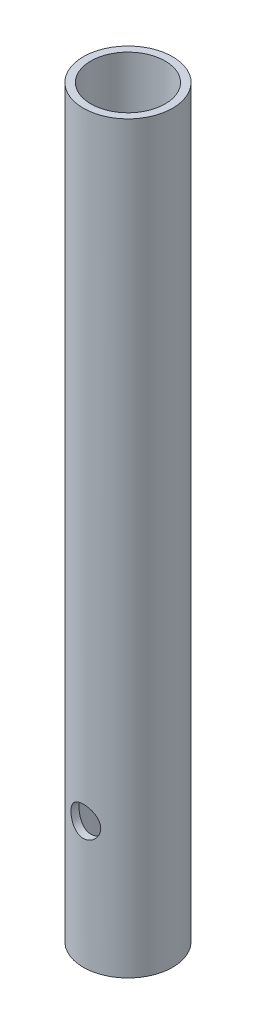
ISO-10303-21;
HEADER;
FILE_DESCRIPTION(('STEP AP214'),'2;1');
FILE_NAME('part.step','',(''),(''),'','','');
FILE_SCHEMA(('AUTOMOTIVE_DESIGN { 1 0 10303 214 1 1 1 1 }'));
ENDSEC;
DATA;
#1=APPLICATION_CONTEXT('core data for automotive mechanical design processes');
#2=APPLICATION_PROTOCOL_DEFINITION('international standard','automotive_design',2000,#1);
#3=PRODUCT_CONTEXT('',#1,'mechanical');
#4=PRODUCT('Part','Part','',(#3));
#5=PRODUCT_RELATED_PRODUCT_CATEGORY('part','',(#4));
#6=PRODUCT_DEFINITION_FORMATION('','',#4);
#7=PRODUCT_DEFINITION_CONTEXT('part definition',#1,'design');
#8=PRODUCT_DEFINITION('design','',#6,#7);
#9=PRODUCT_DEFINITION_SHAPE('','',#8);
#10=(LENGTH_UNIT() NAMED_UNIT(*) SI_UNIT(.MILLI.,.METRE.));
#11=(NAMED_UNIT(*) PLANE_ANGLE_UNIT() SI_UNIT($,.RADIAN.));
#12=(NAMED_UNIT(*) SI_UNIT($,.STERADIAN.) SOLID_ANGLE_UNIT());
#13=UNCERTAINTY_MEASURE_WITH_UNIT(LENGTH_MEASURE(1.E-05),#10,'distance_accuracy_value','');
#14=(GEOMETRIC_REPRESENTATION_CONTEXT(3) GLOBAL_UNCERTAINTY_ASSIGNED_CONTEXT((#13)) GLOBAL_UNIT_ASSIGNED_CONTEXT((#10,
#11,#12)) REPRESENTATION_CONTEXT('',''));
#15=CARTESIAN_POINT('',(0.,0.,0.));
#16=DIRECTION('',(0.,0.,1.));
#17=DIRECTION('',(1.,0.,0.));
#18=AXIS2_PLACEMENT_3D('',#15,#16,#17);
#19=CARTESIAN_POINT('',(0.,100.,0.));
#20=DIRECTION('',(0.,1.,0.));
#21=DIRECTION('',(0.,0.,1.));
#22=AXIS2_PLACEMENT_3D('',#19,#20,#21);
#23=PLANE('',#22);
#24=CARTESIAN_POINT('',(0.,100.,0.));
#25=DIRECTION('',(0.,1.,0.));
#26=DIRECTION('',(0.,0.,1.));
#27=AXIS2_PLACEMENT_3D('',#24,#25,#26);
#28=CIRCLE('',#27,6.);
#29=CARTESIAN_POINT('',(0.,100.,6.));
#30=VERTEX_POINT('',#29);
#31=EDGE_CURVE('E11',#30,#30,#28,.T.);
#32=ORIENTED_EDGE('',*,*,#31,.T.);
#33=EDGE_LOOP('',(#32));
#34=FACE_BOUND('',#33,.T.);
#35=CARTESIAN_POINT('',(0.,100.,0.));
#36=DIRECTION('',(0.,1.,0.));
#37=DIRECTION('',(1.,0.,0.));
#38=AXIS2_PLACEMENT_3D('',#35,#36,#37);
#39=CIRCLE('',#38,5.);
#40=CARTESIAN_POINT('',(5.,100.,0.));
#41=VERTEX_POINT('',#40);
#42=EDGE_CURVE('E58',#41,#41,#39,.T.);
#43=ORIENTED_EDGE('',*,*,#42,.F.);
#44=EDGE_LOOP('',(#43));
#45=FACE_BOUND('',#44,.T.);
#46=ADVANCED_FACE('F39',(#34,#45),#23,.T.);
#47=CARTESIAN_POINT('',(0.,0.,0.));
#48=DIRECTION('',(0.,1.,0.));
#49=DIRECTION('',(0.,0.,1.));
#50=AXIS2_PLACEMENT_3D('',#47,#48,#49);
#51=PLANE('',#50);
#52=CARTESIAN_POINT('',(0.,0.,0.));
#53=DIRECTION('',(0.,1.,0.));
#54=DIRECTION('',(0.,0.,1.));
#55=AXIS2_PLACEMENT_3D('',#52,#53,#54);
#56=CIRCLE('',#55,6.);
#57=CARTESIAN_POINT('',(0.,0.,6.));
#58=VERTEX_POINT('',#57);
#59=EDGE_CURVE('E53',#58,#58,#56,.T.);
#60=ORIENTED_EDGE('',*,*,#59,.F.);
#61=EDGE_LOOP('',(#60));
#62=FACE_BOUND('',#61,.T.);
#63=CARTESIAN_POINT('',(0.,0.,0.));
#64=DIRECTION('',(0.,1.,0.));
#65=DIRECTION('',(1.,0.,0.));
#66=AXIS2_PLACEMENT_3D('',#63,#64,#65);
#67=CIRCLE('',#66,5.);
#68=CARTESIAN_POINT('',(5.,0.,0.));
#69=VERTEX_POINT('',#68);
#70=EDGE_CURVE('E61',#69,#69,#67,.T.);
#71=ORIENTED_EDGE('',*,*,#70,.T.);
#72=EDGE_LOOP('',(#71));
#73=FACE_BOUND('',#72,.T.);
#74=ADVANCED_FACE('F97',(#62,#73),#51,.F.);
#75=CARTESIAN_POINT('',(0.,100.,0.));
#76=DIRECTION('',(0.,-1.,0.));
#77=DIRECTION('',(0.,0.,-1.));
#78=AXIS2_PLACEMENT_3D('',#75,#76,#77);
#79=CYLINDRICAL_SURFACE('',#78,6.);
#80=CARTESIAN_POINT('',(0.,19.,-6.));
#81=CARTESIAN_POINT('',(-0.109126725773447,19.0000005074633,-6.00000030601888));
#82=CARTESIAN_POINT('',(-0.218250389077101,18.9910394677456,-5.9969953901509));
#83=CARTESIAN_POINT('',(-0.433283521745947,18.9555417823656,-5.98530420406562));
#84=CARTESIAN_POINT('',(-0.539192656237637,18.9290033121022,-5.97661734404305));
#85=CARTESIAN_POINT('',(-0.744665579003553,18.8593615132319,-5.95450615812885));
#86=CARTESIAN_POINT('',(-0.84423965177207,18.8162858750815,-5.94108975461707));
#87=CARTESIAN_POINT('',(-1.03474987361065,18.7149176543233,-5.91088891434684));
#88=CARTESIAN_POINT('',(-1.12568431391741,18.6566220699948,-5.89410381335556));
#89=CARTESIAN_POINT('',(-1.29948335004454,18.5243483902825,-5.8582818888601));
#90=CARTESIAN_POINT('',(-1.38200740059662,18.449937531479,-5.8391911292757));
#91=CARTESIAN_POINT('',(-1.53366538540417,18.2884656905869,-5.80120629566243));
#92=CARTESIAN_POINT('',(-1.60279637097893,18.201401930143,-5.78231226581098));
#93=CARTESIAN_POINT('',(-1.72764988445572,18.0140297696071,-5.74626664954547));
#94=CARTESIAN_POINT('',(-1.78292971644207,17.9134125205358,-5.72918078551376));
#95=CARTESIAN_POINT('',(-1.87563774775545,17.7036478110829,-5.69950610837202));
#96=CARTESIAN_POINT('',(-1.91307139477353,17.5945029656745,-5.68691592321491));
#97=CARTESIAN_POINT('',(-1.96774692301833,17.3746535570066,-5.66822606538754));
#98=CARTESIAN_POINT('',(-1.98562689654354,17.2641255830219,-5.66192191539222));
#99=CARTESIAN_POINT('',(-2.00268224666896,17.0414724916882,-5.65591313259015));
#100=CARTESIAN_POINT('',(-2.00186340320944,16.9293478785816,-5.6562064604546));
#101=CARTESIAN_POINT('',(-1.98203980740684,16.712126739112,-5.6631803001636));
#102=CARTESIAN_POINT('',(-1.96386782633399,16.606943194162,-5.66956831735066));
#103=CARTESIAN_POINT('',(-1.91121232569884,16.4012131607863,-5.68753315449102));
#104=CARTESIAN_POINT('',(-1.87672685318375,16.3006672291299,-5.69911059568215));
#105=CARTESIAN_POINT('',(-1.79187811612043,16.105174500817,-5.72635822262497));
#106=CARTESIAN_POINT('',(-1.74126809741453,16.0103439490609,-5.74209131586235));
#107=CARTESIAN_POINT('',(-1.62577821260628,15.8302581834405,-5.77585117151453));
#108=CARTESIAN_POINT('',(-1.56089422472802,15.7450057461332,-5.79387859580927));
#109=CARTESIAN_POINT('',(-1.41469866536448,15.5818168036785,-5.83134658335482));
#110=CARTESIAN_POINT('',(-1.33270630015263,15.5044946109819,-5.85081178709686));
#111=CARTESIAN_POINT('',(-1.15667913994013,15.3645374666732,-5.88813876774073));
#112=CARTESIAN_POINT('',(-1.06264319132163,15.301903923671,-5.90600039076135));
#113=CARTESIAN_POINT('',(-0.863895226092539,15.1926073995299,-5.93834215875587));
#114=CARTESIAN_POINT('',(-0.759086552832676,15.1461090173185,-5.95278700016078));
#115=CARTESIAN_POINT('',(-0.542538166729018,15.0715936520886,-5.9764113428887));
#116=CARTESIAN_POINT('',(-0.43080087630991,15.0435702491531,-5.98559267309759));
#117=CARTESIAN_POINT('',(-0.20876765905861,15.0078886679553,-5.99735254142881));
#118=CARTESIAN_POINT('',(-0.0986191997296942,14.9994003816545,-6.00020003667456));
#119=CARTESIAN_POINT('',(0.121550139920474,15.0006653471969,-5.99977805389655));
#120=CARTESIAN_POINT('',(0.2315710386393,15.0104155199597,-5.99650960838725));
#121=CARTESIAN_POINT('',(0.445039732608511,15.0472238154719,-5.98440049434209));
#122=CARTESIAN_POINT('',(0.548585613669687,15.073772412099,-5.97572397422385));
#123=CARTESIAN_POINT('',(0.749711917159147,15.1427868889335,-5.9538369366014));
#124=CARTESIAN_POINT('',(0.847291577017213,15.1852547989356,-5.9406258409335));
#125=CARTESIAN_POINT('',(1.03657659278655,15.2861408636816,-5.91057862574579));
#126=CARTESIAN_POINT('',(1.1280599184343,15.3449491865663,-5.89365629511572));
#127=CARTESIAN_POINT('',(1.30012966027118,15.476388300027,-5.85810507832525));
#128=CARTESIAN_POINT('',(1.38071273559116,15.5490233120635,-5.83947567187655));
#129=CARTESIAN_POINT('',(1.5325050156126,15.7099575020132,-5.80153695960889));
#130=CARTESIAN_POINT('',(1.60312193849154,15.7988184538537,-5.78223522174856));
#131=CARTESIAN_POINT('',(1.72851504464715,15.9875431356218,-5.74599946589417));
#132=CARTESIAN_POINT('',(1.78329109586203,16.0874069572681,-5.72906546764005));
#133=CARTESIAN_POINT('',(1.87519386083273,16.2953460305798,-5.69964783582767));
#134=CARTESIAN_POINT('',(1.91235626433005,16.4034041583375,-5.68715521585957));
#135=CARTESIAN_POINT('',(1.96778933351872,16.6247573000883,-5.66821664612899));
#136=CARTESIAN_POINT('',(1.98606850990788,16.7380499308087,-5.66176797247279));
#137=CARTESIAN_POINT('',(2.00255256495469,16.9603941920818,-5.65595717748354));
#138=CARTESIAN_POINT('',(2.0017405146168,17.0693646805736,-5.6562480051483));
#139=CARTESIAN_POINT('',(1.98248458689739,17.2855301498441,-5.66302539647735));
#140=CARTESIAN_POINT('',(1.96404175891718,17.3927252359102,-5.66951159138723));
#141=CARTESIAN_POINT('',(1.9107436262587,17.6002713260049,-5.68769048609783));
#142=CARTESIAN_POINT('',(1.87620669203103,17.700713650009,-5.69928196044955));
#143=CARTESIAN_POINT('',(1.7919587315195,17.8944548138765,-5.72632797636937));
#144=CARTESIAN_POINT('',(1.74224433710762,17.987752062376,-5.74178337526786));
#145=CARTESIAN_POINT('',(1.62652138516687,18.1689673398458,-5.77565658452092));
#146=CARTESIAN_POINT('',(1.55989648552917,18.2564730037968,-5.79417423284274));
#147=CARTESIAN_POINT('',(1.4132857662713,18.4193796267684,-5.83166712566506));
#148=CARTESIAN_POINT('',(1.33329616890297,18.4947771513762,-5.85064249824745));
#149=CARTESIAN_POINT('',(1.15848311384138,18.6342888245784,-5.88780061051088));
#150=CARTESIAN_POINT('',(1.06320302699946,18.697848695502,-5.90592363602513));
#151=CARTESIAN_POINT('',(0.862714714813254,18.8079808577013,-5.93851982345224));
#152=CARTESIAN_POINT('',(0.757509036264702,18.8545574918441,-5.9529939181586));
#153=CARTESIAN_POINT('',(0.544987294401956,18.9274432649774,-5.97611030137084));
#154=CARTESIAN_POINT('',(0.437975515352821,18.9545649325268,-5.98498424845045));
#155=CARTESIAN_POINT('',(0.220640832020496,18.9908405613543,-5.99692814128444));
#156=CARTESIAN_POINT('',(0.110318851137494,18.9999994869931,-5.9999996906381));
#157=CARTESIAN_POINT('',(0.,19.,-6.));
#158=B_SPLINE_CURVE_WITH_KNOTS('',3,(#80,#81,#82,#83,#84,#85,#86,#87,#88,#89,#90,#91,#92,#93,
#94,#95,#96,#97,#98,#99,#100,#101,#102,#103,#104,#105,#106,#107,#108,#109,#110,#111,#112,#113,
#114,#115,#116,#117,#118,#119,#120,#121,#122,#123,#124,#125,#126,#127,#128,#129,#130,#131,#132,
#133,#134,#135,#136,#137,#138,#139,#140,#141,#142,#143,#144,#145,#146,#147,#148,#149,#150,#151,
#152,#153,#154,#155,#156,#157),.UNSPECIFIED.,.T.,.F.,(4,2,2,2,2,2,2,2,2,2,2,2,2,2,2,2,2,2,2,2,2,
2,2,2,2,2,2,2,2,2,2,2,2,2,2,2,2,2,4),(0.,0.326974212052023,0.653982370535041,0.980445345740548,
1.3069727555982,1.64369368565512,1.98048866575061,2.32696769646941,2.67334089385667,
3.00803851483681,3.34263267974972,3.66193653102562,3.98127861710965,4.30576342310262,
4.63034205116415,4.97186611622735,5.31342291933238,5.65836811300716,6.00319337754418,
6.33307166350341,6.66289426328355,6.98316315956428,7.30347290568209,7.63220799687475,
7.96104361643784,8.30482045761506,8.64860016469995,8.99168027653543,9.33460569411683,
9.65991332128519,9.98520158702753,10.3043117416084,10.6234927635196,10.9566013338361,
11.2898042224756,11.635993216702,11.9820936230492,12.3127311674763,12.6432773207628),.UNSPECIFIED.);
#159=CARTESIAN_POINT('',(0.,19.,-6.));
#160=VERTEX_POINT('',#159);
#161=EDGE_CURVE('E86',#160,#160,#158,.T.);
#162=ORIENTED_EDGE('',*,*,#161,.T.);
#163=EDGE_LOOP('',(#162));
#164=FACE_BOUND('',#163,.T.);
#165=CARTESIAN_POINT('',(2.00000000000001,17.,5.65685424949238));
#166=CARTESIAN_POINT('',(2.00000051589543,16.8910636503279,5.65685389060868));
#167=CARTESIAN_POINT('',(1.99106956737105,16.7821304003528,5.66003538581715));
#168=CARTESIAN_POINT('',(1.95570226337762,16.5674911580115,5.6723514816251));
#169=CARTESIAN_POINT('',(1.9292630243368,16.4617857002551,5.68148706284377));
#170=CARTESIAN_POINT('',(1.85991097136981,16.2567462140054,5.70456407377583));
#171=CARTESIAN_POINT('',(1.81703044280649,16.1574001411146,5.71849607942644));
#172=CARTESIAN_POINT('',(1.71612325688276,15.9672799029041,5.74958244020649));
#173=CARTESIAN_POINT('',(1.65809325772037,15.8765076348927,5.76673750607225));
#174=CARTESIAN_POINT('',(1.52610229288576,15.7025600753234,5.80308978814946));
#175=CARTESIAN_POINT('',(1.45164868275584,15.6197691426565,5.82233789689288));
#176=CARTESIAN_POINT('',(1.28997533442879,15.4675863975507,5.86027729602006));
#177=CARTESIAN_POINT('',(1.20275355010475,15.3981967368353,5.87896849657923));
#178=CARTESIAN_POINT('',(1.01520901593002,15.2730422053408,5.91427733843598));
#179=CARTESIAN_POINT('',(0.914603822449052,15.2176800587641,5.93082815403211));
#180=CARTESIAN_POINT('',(0.704862445974948,15.124816829745,5.95939173541966));
#181=CARTESIAN_POINT('',(0.595728571374424,15.0873109336462,5.97140572406004));
#182=CARTESIAN_POINT('',(0.376057634866988,15.0325282907352,5.98918150863813));
#183=CARTESIAN_POINT('',(0.265701509705936,15.014593107486,5.99514629555118));
#184=CARTESIAN_POINT('',(0.0433957496481775,14.9973674132787,6.00087216436496));
#185=CARTESIAN_POINT('',(-0.0685534670877946,14.9980720966952,6.00063484525791));
#186=CARTESIAN_POINT('',(-0.286207030387632,15.0176885091321,5.99412079237463));
#187=CARTESIAN_POINT('',(-0.391984097183316,15.035885056949,5.98808129510235));
#188=CARTESIAN_POINT('',(-0.598886877644347,15.0887859619609,5.97093934679463));
#189=CARTESIAN_POINT('',(-0.700012275558435,15.1234914379596,5.95983655262364));
#190=CARTESIAN_POINT('',(-0.89630494968395,15.2088426346121,5.93351340586448));
#191=CARTESIAN_POINT('',(-0.991376441937694,15.259691877093,5.91824085048031));
#192=CARTESIAN_POINT('',(-1.17184865105465,15.3757194108973,5.88516786077838));
#193=CARTESIAN_POINT('',(-1.25724666877069,15.4409016866553,5.86736672402934));
#194=CARTESIAN_POINT('',(-1.42020173310262,15.5873487869194,5.83012383699793));
#195=CARTESIAN_POINT('',(-1.49720031413055,15.669226315683,5.81064430337755));
#196=CARTESIAN_POINT('',(-1.63655451919635,15.8448974514532,5.77294670497801));
#197=CARTESIAN_POINT('',(-1.69890788656309,15.9386928914561,5.75472883491231));
#198=CARTESIAN_POINT('',(-1.80797491007149,16.1373072512069,5.72141050242224));
#199=CARTESIAN_POINT('',(-1.85445292724269,16.2422642626355,5.70635818569496));
#200=CARTESIAN_POINT('',(-1.92888638653868,16.4591427884288,5.68163301648769));
#201=CARTESIAN_POINT('',(-1.95684959149499,16.5710613624125,5.67195790974185));
#202=CARTESIAN_POINT('',(-1.99232256419505,16.7932767108232,5.6595927263117));
#203=CARTESIAN_POINT('',(-2.00069819101527,16.9034188494973,5.65660720637512));
#204=CARTESIAN_POINT('',(-1.99921087781944,17.1235522982282,5.65713344118369));
#205=CARTESIAN_POINT('',(-1.98935125045353,17.233543632048,5.66064401583629));
#206=CARTESIAN_POINT('',(-1.95245130310463,17.4463139314238,5.67347236180599));
#207=CARTESIAN_POINT('',(-1.92601278796137,17.5492108603017,5.68258650881681));
#208=CARTESIAN_POINT('',(-1.85742772512094,17.7490872124784,5.70537107342046));
#209=CARTESIAN_POINT('',(-1.81527839272685,17.8460655831816,5.71904229869679));
#210=CARTESIAN_POINT('',(-1.71494868147788,18.034760841694,5.74993755191574));
#211=CARTESIAN_POINT('',(-1.656302236717,18.1262132852836,5.76726051331257));
#212=CARTESIAN_POINT('',(-1.52517126111512,18.2982921047674,5.8033153746193));
#213=CARTESIAN_POINT('',(-1.45268265099757,18.3789152773224,5.82204768887589));
#214=CARTESIAN_POINT('',(-1.29178341180065,18.5310559681813,5.85990077275698));
#215=CARTESIAN_POINT('',(-1.20277454109331,18.6019487800377,5.87899687155793));
#216=CARTESIAN_POINT('',(-1.01365458280052,18.7278322846961,5.91453703226218));
#217=CARTESIAN_POINT('',(-0.913543889729108,18.7828235423249,5.93098118835389));
#218=CARTESIAN_POINT('',(-0.705559724864594,18.8748402097234,5.95928811621206));
#219=CARTESIAN_POINT('',(-0.597742246642395,18.9119825542961,5.97118060009062));
#220=CARTESIAN_POINT('',(-0.376916931692033,18.9674554841202,5.98917221675549));
#221=CARTESIAN_POINT('',(-0.263910983907778,18.985792859761,5.99527344068038));
#222=CARTESIAN_POINT('',(-0.0416306717200807,19.0025241552113,6.00083726472513));
#223=CARTESIAN_POINT('',(0.0675694478400383,19.0018149078648,6.00059840178878));
#224=CARTESIAN_POINT('',(0.28422229000035,18.9826853837072,5.99424393038796));
#225=CARTESIAN_POINT('',(0.391675153638116,18.9642665436945,5.98812879867152));
#226=CARTESIAN_POINT('',(0.600084238864121,18.9108355308481,5.97081829908825));
#227=CARTESIAN_POINT('',(0.701116541825582,18.8760915692941,5.95970516722297));
#228=CARTESIAN_POINT('',(0.895956701879595,18.7912449378057,5.9335432140899));
#229=CARTESIAN_POINT('',(0.989763248284868,18.741139489606,5.91849368096033));
#230=CARTESIAN_POINT('',(1.17126803261757,18.624860975796,5.88531737655762));
#231=CARTESIAN_POINT('',(1.25861250311522,18.5581626292367,5.86709744983853));
#232=CARTESIAN_POINT('',(1.42116205254486,18.4114852176876,5.82985977583759));
#233=CARTESIAN_POINT('',(1.49636324324919,18.3315019154746,5.81084177546194));
#234=CARTESIAN_POINT('',(1.63548361766624,18.1567812888261,5.77326559651196));
#235=CARTESIAN_POINT('',(1.69884593199581,18.0615889780467,5.75475455977261));
#236=CARTESIAN_POINT('',(1.80862868660223,17.8613311461944,5.7212038664603));
#237=CARTESIAN_POINT('',(1.85505355363895,17.7562682139407,5.70616330322498));
#238=CARTESIAN_POINT('',(1.92768765640834,17.5440763519687,5.68202668413029));
#239=CARTESIAN_POINT('',(1.95471581829904,17.4372554729493,5.67269265714364));
#240=CARTESIAN_POINT('',(1.99086864029854,17.2202878990666,5.66010767079036));
#241=CARTESIAN_POINT('',(1.99999947839319,17.1101423651786,5.65685461234922));
#242=CARTESIAN_POINT('',(2.00000000000001,17.,5.65685424949238));
#243=B_SPLINE_CURVE_WITH_KNOTS('',3,(#165,#166,#167,#168,#169,#170,#171,#172,#173,#174,#175,
#176,#177,#178,#179,#180,#181,#182,#183,#184,#185,#186,#187,#188,#189,#190,#191,#192,#193,#194,
#195,#196,#197,#198,#199,#200,#201,#202,#203,#204,#205,#206,#207,#208,#209,#210,#211,#212,#213,
#214,#215,#216,#217,#218,#219,#220,#221,#222,#223,#224,#225,#226,#227,#228,#229,#230,#231,#232,
#233,#234,#235,#236,#237,#238,#239,#240,#241,#242),.UNSPECIFIED.,.T.,.F.,(4,2,2,2,2,2,2,2,2,2,2,
2,2,2,2,2,2,2,2,2,2,2,2,2,2,2,2,2,2,2,2,2,2,2,2,2,2,2,4),(0.,0.326401169598714,0.65285611003033,
0.978673255001661,1.30456233237089,1.64202674855137,1.97954530343976,2.32587012287315,
2.67210152773579,3.00628637529869,3.34038506604655,3.66138009651139,3.98239688378474,
4.30763309720671,4.63295983748045,4.97360348727837,5.31429959224213,5.65985279686113,
6.00526102713233,6.33508582728881,6.66485071674469,6.98328791537554,7.30178158293893,
7.63037715471432,7.95906971324257,8.30357616342187,8.64807037515067,8.99027582381705,
9.33235766008315,9.65836169355273,9.98433928019565,10.3051391208086,10.6259970152649,
10.9587103904127,11.2915300886527,11.6373780547229,11.9831355653374,12.3132642432538,
12.6432789438093),.UNSPECIFIED.);
#244=CARTESIAN_POINT('',(2.00000000000001,17.,5.65685424949238));
#245=VERTEX_POINT('',#244);
#246=EDGE_CURVE('E81',#245,#245,#243,.T.);
#247=ORIENTED_EDGE('',*,*,#246,.T.);
#248=EDGE_LOOP('',(#247));
#249=FACE_BOUND('',#248,.T.);
#250=ORIENTED_EDGE('',*,*,#31,.F.);
#251=EDGE_LOOP('',(#250));
#252=FACE_BOUND('',#251,.T.);
#253=ORIENTED_EDGE('',*,*,#59,.T.);
#254=EDGE_LOOP('',(#253));
#255=FACE_BOUND('',#254,.T.);
#256=ADVANCED_FACE('F41',(#164,#249,#252,#255),#79,.T.);
#257=CARTESIAN_POINT('',(0.,100.,0.));
#258=DIRECTION('',(0.,-1.,0.));
#259=DIRECTION('',(0.,0.,-1.));
#260=AXIS2_PLACEMENT_3D('',#257,#258,#259);
#261=CYLINDRICAL_SURFACE('',#260,5.);
#262=CARTESIAN_POINT('',(0.,19.,-5.));
#263=CARTESIAN_POINT('',(-0.107493005442893,18.9999901481763,-4.99999271227085));
#264=CARTESIAN_POINT('',(-0.215172564090677,18.9912822479116,-4.99649294306933));
#265=CARTESIAN_POINT('',(-0.4274964804179,18.9567522964788,-4.98283453100642));
#266=CARTESIAN_POINT('',(-0.532131777561251,18.9308837209139,-4.97265778698877));
#267=CARTESIAN_POINT('',(-0.734953922727404,18.8631239219412,-4.94674209213119));
#268=CARTESIAN_POINT('',(-0.83316066161696,18.8212851537833,-4.93102136364072));
#269=CARTESIAN_POINT('',(-1.02107197032837,18.7229808266735,-4.89556610796078));
#270=CARTESIAN_POINT('',(-1.110779476751,18.6665203450811,-4.87583297458057));
#271=CARTESIAN_POINT('',(-1.2835010075704,18.5377645014391,-4.83330886170419));
#272=CARTESIAN_POINT('',(-1.36606227255022,18.4648933437597,-4.81042296929191));
#273=CARTESIAN_POINT('',(-1.51817500478473,18.3065999965232,-4.76460576906194));
#274=CARTESIAN_POINT('',(-1.58772010713354,18.2211717027883,-4.74167444453792));
#275=CARTESIAN_POINT('',(-1.71487456729288,18.0355719297577,-4.69722791797136));
#276=CARTESIAN_POINT('',(-1.77181498119548,17.9349135139768,-4.67582115964951));
#277=CARTESIAN_POINT('',(-1.86775471903715,17.72446360158,-4.63833647186792));
#278=CARTESIAN_POINT('',(-1.90676256428584,17.6146764721516,-4.62225601244176));
#279=CARTESIAN_POINT('',(-1.96389882339587,17.3942876664079,-4.59826357660818));
#280=CARTESIAN_POINT('',(-1.98289396580565,17.2839487644238,-4.59001420355605));
#281=CARTESIAN_POINT('',(-2.00217296164003,17.0613650016927,-4.58164004049144));
#282=CARTESIAN_POINT('',(-2.00246601631323,16.949121105375,-4.58151125522768));
#283=CARTESIAN_POINT('',(-1.98498936750455,16.734243328542,-4.58910500279994));
#284=CARTESIAN_POINT('',(-1.96847531430514,16.631484285591,-4.5962817503845));
#285=CARTESIAN_POINT('',(-1.91994688029782,16.4303404439933,-4.61676187607836));
#286=CARTESIAN_POINT('',(-1.88792979480464,16.3319564118897,-4.63006632321673));
#287=CARTESIAN_POINT('',(-1.80869473255108,16.139982163804,-4.6615948508853));
#288=CARTESIAN_POINT('',(-1.76117986231532,16.0465307609453,-4.67991379280788));
#289=CARTESIAN_POINT('',(-1.65250646073222,15.8685841836384,-4.7193811638989));
#290=CARTESIAN_POINT('',(-1.59134280510085,15.7840923905972,-4.74053065456848));
#291=CARTESIAN_POINT('',(-1.45155059945444,15.619590271198,-4.78526736742271));
#292=CARTESIAN_POINT('',(-1.37193746297064,15.540431270554,-4.80891664976152));
#293=CARTESIAN_POINT('',(-1.2003144274302,15.396315521998,-4.85459824958282));
#294=CARTESIAN_POINT('',(-1.10830206533444,15.3313616025897,-4.87663024445325));
#295=CARTESIAN_POINT('',(-0.912077652605847,15.2163825525842,-4.91714681264548));
#296=CARTESIAN_POINT('',(-0.807660491346481,15.1666777188029,-4.93555270095415));
#297=CARTESIAN_POINT('',(-0.591023765482885,15.0858321389219,-4.96614828328759));
#298=CARTESIAN_POINT('',(-0.478808196849676,15.0546819624426,-4.97834113462382));
#299=CARTESIAN_POINT('',(-0.256895887607822,15.0135517045803,-4.99456139506911));
#300=CARTESIAN_POINT('',(-0.147443293985536,15.0024275457464,-4.99902945833514));
#301=CARTESIAN_POINT('',(0.0718453098078168,14.9982868994714,-5.00068478510631));
#302=CARTESIAN_POINT('',(0.181681213223923,15.0052657184525,-4.99787393582292));
#303=CARTESIAN_POINT('',(0.393432739121988,15.036291752552,-4.98557567063753));
#304=CARTESIAN_POINT('',(0.495482491775475,15.059557980351,-4.97639391345523));
#305=CARTESIAN_POINT('',(0.694135428060781,15.1214357083098,-4.952594414055));
#306=CARTESIAN_POINT('',(0.790737910224846,15.1600491796687,-4.93797597356531));
#307=CARTESIAN_POINT('',(0.979078785816704,15.2527849396799,-4.90416594770812));
#308=CARTESIAN_POINT('',(1.07057802275541,15.3073454720431,-4.88484815979804));
#309=CARTESIAN_POINT('',(1.24344359124656,15.4299403239056,-4.84373364745525));
#310=CARTESIAN_POINT('',(1.32480584076113,15.4979800429226,-4.8219359311027));
#311=CARTESIAN_POINT('',(1.48072304302882,15.6508700129496,-4.77645117638112));
#312=CARTESIAN_POINT('',(1.55447393380607,15.7365335415062,-4.75273441425052));
#313=CARTESIAN_POINT('',(1.68675119741371,15.9194400830094,-4.70741672917132));
#314=CARTESIAN_POINT('',(1.74527506133751,16.0166850003399,-4.68581615526511));
#315=CARTESIAN_POINT('',(1.84580750193163,16.2214616945941,-4.64714299907708));
#316=CARTESIAN_POINT('',(1.88765059453446,16.3290839992123,-4.63011630884788));
#317=CARTESIAN_POINT('',(1.95229621970531,16.5507336517152,-4.60323673477931));
#318=CARTESIAN_POINT('',(1.97511280526932,16.6647562058124,-4.59337855695998));
#319=CARTESIAN_POINT('',(1.99971561727841,16.8871279017745,-4.58271759299926));
#320=CARTESIAN_POINT('',(2.00289708230287,16.9952948395934,-4.58131421008171));
#321=CARTESIAN_POINT('',(1.99180315927753,17.2105448577133,-4.58614836033098));
#322=CARTESIAN_POINT('',(1.97752998791379,17.3176280739026,-4.59238492324793));
#323=CARTESIAN_POINT('',(1.93307136615365,17.523332189855,-4.6112664907902));
#324=CARTESIAN_POINT('',(1.90353749357098,17.622120274433,-4.62364831827449));
#325=CARTESIAN_POINT('',(1.83000544849102,17.8133786296135,-4.65324001232696));
#326=CARTESIAN_POINT('',(1.78600328139382,17.9058471468998,-4.67045121206007));
#327=CARTESIAN_POINT('',(1.68187276275974,18.0876096192708,-4.70898609604491));
#328=CARTESIAN_POINT('',(1.62096533515949,18.1764186701305,-4.73048882313242));
#329=CARTESIAN_POINT('',(1.4858921192715,18.3429933172038,-4.77463804372237));
#330=CARTESIAN_POINT('',(1.41172233481813,18.4207555721283,-4.79728488048406));
#331=CARTESIAN_POINT('',(1.24650550627247,18.5682028532636,-4.84293567087394));
#332=CARTESIAN_POINT('',(1.15467600114614,18.6370373068981,-4.86586757962185));
#333=CARTESIAN_POINT('',(0.959900320285783,18.7583370426216,-4.90800406713717));
#334=CARTESIAN_POINT('',(0.856949004547241,18.8107947121525,-4.92720691092906));
#335=CARTESIAN_POINT('',(0.644738062495204,18.8966222151903,-4.95939714815861));
#336=CARTESIAN_POINT('',(0.535631618219695,18.9303293235603,-4.97249363055028));
#337=CARTESIAN_POINT('',(0.31287654628122,18.9786391209543,-4.99144306209366));
#338=CARTESIAN_POINT('',(0.199243525858913,18.9933024367439,-4.99731899495638));
#339=CARTESIAN_POINT('',(0.05691229789093,18.9993953809783,-4.99975899504137));
#340=CARTESIAN_POINT('',(0.0284626887407585,19.0000026086292,-5.00000192969176));
#341=CARTESIAN_POINT('',(0.,19.,-5.));
#342=B_SPLINE_CURVE_WITH_KNOTS('',3,(#262,#263,#264,#265,#266,#267,#268,#269,#270,#271,#272,
#273,#274,#275,#276,#277,#278,#279,#280,#281,#282,#283,#284,#285,#286,#287,#288,#289,#290,#291,
#292,#293,#294,#295,#296,#297,#298,#299,#300,#301,#302,#303,#304,#305,#306,#307,#308,#309,#310,
#311,#312,#313,#314,#315,#316,#317,#318,#319,#320,#321,#322,#323,#324,#325,#326,#327,#328,#329,
#330,#331,#332,#333,#334,#335,#336,#337,#338,#339,#340,#341),.UNSPECIFIED.,.T.,.F.,(4,2,2,2,2,2,
2,2,2,2,2,2,2,2,2,2,2,2,2,2,2,2,2,2,2,2,2,2,2,2,2,2,2,2,2,2,2,2,2,4),(0.,0.322402987893075,
0.645683636007935,0.967911457471582,1.29002753567984,1.62597381700398,1.96208394934412,
2.31315258819217,2.66405423118268,2.99904105308829,3.33386306340489,3.64538328401373,
3.95695787256048,4.27489126298817,4.59294421938184,4.93558349186558,5.27829092839734,
5.62776913162807,5.97706956113792,6.30569184528009,6.63422893570084,6.94800455564367,
7.26182048993798,7.58523513398264,7.9087795949897,8.25368474624415,8.5986466904375,
8.9469504514083,9.29499672645936,9.6179967339275,9.94095572563048,10.2511431854877,
10.5614163580516,10.8894546805669,11.217592013484,11.5670042353384,11.9165786364054,
12.2596430101332,12.6016125240435,12.686980458968),.UNSPECIFIED.);
#343=CARTESIAN_POINT('',(0.,19.,-5.));
#344=VERTEX_POINT('',#343);
#345=EDGE_CURVE('E44',#344,#344,#342,.T.);
#346=ORIENTED_EDGE('',*,*,#345,.F.);
#347=EDGE_LOOP('',(#346));
#348=FACE_BOUND('',#347,.T.);
#349=CARTESIAN_POINT('',(2.00000000000001,17.,4.58257569495584));
#350=CARTESIAN_POINT('',(1.99999540068023,16.892876310287,4.58258022779737));
#351=CARTESIAN_POINT('',(1.99134173553407,16.7855737056682,4.58638433797122));
#352=CARTESIAN_POINT('',(1.95706710874824,16.5740609159004,4.601110833066));
#353=CARTESIAN_POINT('',(1.93140279032341,16.4698593456615,4.61205140628347));
#354=CARTESIAN_POINT('',(1.86423554476216,16.2679481910292,4.63960410719222));
#355=CARTESIAN_POINT('',(1.82279228998551,16.1702157567088,4.65619484260882));
#356=CARTESIAN_POINT('',(1.72542013194153,15.9831146451377,4.69314677188873));
#357=CARTESIAN_POINT('',(1.66949439157707,15.8937441474759,4.71350714220611));
#358=CARTESIAN_POINT('',(1.54132201423254,15.7207396854557,4.75700861562335));
#359=CARTESIAN_POINT('',(1.46837936836551,15.6376436006028,4.78023917022606));
#360=CARTESIAN_POINT('',(1.30970909513216,15.4844709791442,4.82612457915278));
#361=CARTESIAN_POINT('',(1.22397701877347,15.4143989922903,4.84877922991762));
#362=CARTESIAN_POINT('',(1.03800631337303,15.2865936096903,4.89203407641395));
#363=CARTESIAN_POINT('',(0.937328966419093,15.2294557003141,4.9125180361257));
#364=CARTESIAN_POINT('',(0.726825322068637,15.1331564298262,4.94803927702516));
#365=CARTESIAN_POINT('',(0.617002769076883,15.0939877537511,4.96307877403249));
#366=CARTESIAN_POINT('',(0.396966427039753,15.0366585140069,4.98538324990609));
#367=CARTESIAN_POINT('',(0.287028984858315,15.0175726860298,4.99298936770628));
#368=CARTESIAN_POINT('',(0.0652663285839603,14.9979715142185,5.00080310687431));
#369=CARTESIAN_POINT('',(-0.0465581658394131,14.9974492440342,5.00101348770556));
#370=CARTESIAN_POINT('',(-0.262232494702091,15.0144827698042,4.99421962820612));
#371=CARTESIAN_POINT('',(-0.366177452870459,15.0310247727547,4.98761996771485));
#372=CARTESIAN_POINT('',(-0.569673109221916,15.079992876303,4.96849291469141));
#373=CARTESIAN_POINT('',(-0.669223484391242,15.1124201423985,4.95596508721342));
#374=CARTESIAN_POINT('',(-0.862897938510562,15.1926364828783,4.92596824457467));
#375=CARTESIAN_POINT('',(-0.956917623378899,15.2406497148154,4.90842760466223));
#376=CARTESIAN_POINT('',(-1.13580815074132,15.3504650069192,4.87014585180275));
#377=CARTESIAN_POINT('',(-1.22067584271797,15.4122717931002,4.84940364267149));
#378=CARTESIAN_POINT('',(-1.38476882799018,15.5526491359439,4.80521637176122));
#379=CARTESIAN_POINT('',(-1.46325784526632,15.6320538925728,4.78168326511758));
#380=CARTESIAN_POINT('',(-1.60610741539265,15.802990571832,4.73561660973263));
#381=CARTESIAN_POINT('',(-1.67046334378699,15.8945264481956,4.71308339008076));
#382=CARTESIAN_POINT('',(-1.78490418871928,16.0904190223739,4.67096897409023));
#383=CARTESIAN_POINT('',(-1.83453465163627,16.1950648303387,4.65148914057708));
#384=CARTESIAN_POINT('',(-1.91517625986646,16.4122154903122,4.61887590344084));
#385=CARTESIAN_POINT('',(-1.94619949837799,16.5247151847266,4.60573837891311));
#386=CARTESIAN_POINT('',(-1.9869549488549,16.7470357774674,4.58829759702716));
#387=CARTESIAN_POINT('',(-1.99787209681455,16.8566004471286,4.58350366456138));
#388=CARTESIAN_POINT('',(-2.00156132644289,17.0760772077596,4.58189497869038));
#389=CARTESIAN_POINT('',(-1.99433891059129,17.1859891832757,4.58507780560362));
#390=CARTESIAN_POINT('',(-1.96303289479004,17.3964589349569,4.59856044359113));
#391=CARTESIAN_POINT('',(-1.93993306202387,17.4971929374001,4.60844457798301));
#392=CARTESIAN_POINT('',(-1.87880418691088,17.6932884047855,4.6337005102734));
#393=CARTESIAN_POINT('',(-1.84077183430228,17.7886486731072,4.64907352488598));
#394=CARTESIAN_POINT('',(-1.74913563948158,17.9756023577957,4.68433781860101));
#395=CARTESIAN_POINT('',(-1.69496286826465,18.0668861886945,4.70438704639177));
#396=CARTESIAN_POINT('',(-1.57316522444183,18.2394829874416,4.74650385157795));
#397=CARTESIAN_POINT('',(-1.5055348734819,18.3207918727954,4.76857224896045));
#398=CARTESIAN_POINT('',(-1.35284421168058,18.4773734085994,4.81420915971416));
#399=CARTESIAN_POINT('',(-1.26686542944544,18.5517565652916,4.83776807285233));
#400=CARTESIAN_POINT('',(-1.08308363336851,18.6851770766098,4.88219794567532));
#401=CARTESIAN_POINT('',(-0.985280138466611,18.7442138065951,4.90306879593135));
#402=CARTESIAN_POINT('',(-0.780279934003016,18.8450476264633,4.9398371590039));
#403=CARTESIAN_POINT('',(-0.673085480998746,18.8868488441737,4.9557358624066));
#404=CARTESIAN_POINT('',(-0.452393590914548,18.9515488523998,4.98072713468904));
#405=CARTESIAN_POINT('',(-0.338899610276819,18.9744579014107,4.98982339706103));
#406=CARTESIAN_POINT('',(-0.116816510362614,18.9995047016528,4.99979008211858));
#407=CARTESIAN_POINT('',(-0.00839049265208623,19.002900128562,5.00115846749745));
#408=CARTESIAN_POINT('',(0.207433835792266,18.9921445206165,4.99686042373721));
#409=CARTESIAN_POINT('',(0.314832299614388,18.9779961418444,4.99119505948774));
#410=CARTESIAN_POINT('',(0.522170901733398,18.9334532120001,4.97371513381836));
#411=CARTESIAN_POINT('',(0.622238803864869,18.9035710552435,4.96209480698998));
#412=CARTESIAN_POINT('',(0.815922355542604,18.8289471941189,4.93394947767358));
#413=CARTESIAN_POINT('',(0.909536811189124,18.7842027490609,4.91742357062859));
#414=CARTESIAN_POINT('',(1.09220303880516,18.6788968066468,4.88018094611867));
#415=CARTESIAN_POINT('',(1.18087037518739,18.6177237246749,4.859311306872));
#416=CARTESIAN_POINT('',(1.34705404014794,18.482211461253,4.8158940222708));
#417=CARTESIAN_POINT('',(1.42456572919735,18.4078668303918,4.79334568464253));
#418=CARTESIAN_POINT('',(1.5712012189445,18.2426848531513,4.7473776736768));
#419=CARTESIAN_POINT('',(1.63950871002776,18.1511114248559,4.72399047228096));
#420=CARTESIAN_POINT('',(1.7598476276315,17.9570575642792,4.68049656850749));
#421=CARTESIAN_POINT('',(1.81187714055768,17.8545758515465,4.66039025195448));
#422=CARTESIAN_POINT('',(1.89399048451635,17.6509638135298,4.62758914239063));
#423=CARTESIAN_POINT('',(1.92562535665268,17.5505383972876,4.61439096680415));
#424=CARTESIAN_POINT('',(1.9727199092849,17.3455109585074,4.5944582603412));
#425=CARTESIAN_POINT('',(1.98822466191608,17.2409214265756,4.58770572290435));
#426=CARTESIAN_POINT('',(1.99692202185513,17.1132217608885,4.5839176394209));
#427=CARTESIAN_POINT('',(1.99807530751896,17.0905985196436,4.58341531117284));
#428=CARTESIAN_POINT('',(1.99961481124251,17.0453195232028,4.58274384722722));
#429=CARTESIAN_POINT('',(2.0000009730612,17.0226637657448,4.5825747359592));
#430=CARTESIAN_POINT('',(2.00000000000001,17.,4.58257569495584));
#431=B_SPLINE_CURVE_WITH_KNOTS('',3,(#349,#350,#351,#352,#353,#354,#355,#356,#357,#358,#359,
#360,#361,#362,#363,#364,#365,#366,#367,#368,#369,#370,#371,#372,#373,#374,#375,#376,#377,#378,
#379,#380,#381,#382,#383,#384,#385,#386,#387,#388,#389,#390,#391,#392,#393,#394,#395,#396,#397,
#398,#399,#400,#401,#402,#403,#404,#405,#406,#407,#408,#409,#410,#411,#412,#413,#414,#415,#416,
#417,#418,#419,#420,#421,#422,#423,#424,#425,#426,#427,#428,#429,#430),.UNSPECIFIED.,.T.,.F.,(4,
2,2,2,2,2,2,2,2,2,2,2,2,2,2,2,2,2,2,2,2,2,2,2,2,2,2,2,2,2,2,2,2,2,2,2,2,2,2,2,4),(0.,
0.321277648767654,0.643377335822249,0.964270823293394,1.28509428823862,1.62255618284425,
1.96013574348343,2.31102669091429,2.66177466969481,2.99554182887184,3.32918445305673,
3.64408644830304,3.95901155129061,4.27868300234899,4.59846414940033,4.93924044081357,
5.28012807127128,5.63064458717259,5.98093304800103,6.30982147524422,6.63861014907941,
6.94867248085147,7.2588035865164,7.58151154652703,7.90435114525851,8.25103734246982,
8.5977376485275,8.94435487312815,9.29078375954139,9.61461039755956,9.93838801512604,
10.2522199444335,10.5661097782859,10.8938705113993,11.2217671656421,11.5699625328562,
11.9181988175919,12.2351666081908,12.5512463021925,12.619212852096,12.6871843847256),.UNSPECIFIED.);
#432=CARTESIAN_POINT('',(2.00000000000001,17.,4.58257569495584));
#433=VERTEX_POINT('',#432);
#434=EDGE_CURVE('E63',#433,#433,#431,.T.);
#435=ORIENTED_EDGE('',*,*,#434,.F.);
#436=EDGE_LOOP('',(#435));
#437=FACE_BOUND('',#436,.T.);
#438=ORIENTED_EDGE('',*,*,#42,.T.);
#439=EDGE_LOOP('',(#438));
#440=FACE_BOUND('',#439,.T.);
#441=ORIENTED_EDGE('',*,*,#70,.F.);
#442=EDGE_LOOP('',(#441));
#443=FACE_BOUND('',#442,.T.);
#444=ADVANCED_FACE('F68',(#348,#437,#440,#443),#261,.F.);
#445=CARTESIAN_POINT('',(0.,17.,-6.));
#446=DIRECTION('',(0.,0.,1.));
#447=DIRECTION('',(1.,0.,0.));
#448=AXIS2_PLACEMENT_3D('',#445,#446,#447);
#449=CYLINDRICAL_SURFACE('',#448,2.00000000000001);
#450=ORIENTED_EDGE('',*,*,#434,.T.);
#451=EDGE_LOOP('',(#450));
#452=FACE_BOUND('',#451,.T.);
#453=ORIENTED_EDGE('',*,*,#246,.F.);
#454=EDGE_LOOP('',(#453));
#455=FACE_BOUND('',#454,.T.);
#456=ADVANCED_FACE('F74',(#452,#455),#449,.F.);
#457=ORIENTED_EDGE('',*,*,#345,.T.);
#458=EDGE_LOOP('',(#457));
#459=FACE_BOUND('',#458,.T.);
#460=ORIENTED_EDGE('',*,*,#161,.F.);
#461=EDGE_LOOP('',(#460));
#462=FACE_BOUND('',#461,.T.);
#463=ADVANCED_FACE('F71',(#459,#462),#449,.F.);
#464=CLOSED_SHELL('',(#46,#74,#256,#444,#456,#463));
#465=MANIFOLD_SOLID_BREP('B2',#464);
#466=ADVANCED_BREP_SHAPE_REPRESENTATION('',(#18,#465),#14);
#467=SHAPE_DEFINITION_REPRESENTATION(#9,#466);
ENDSEC;
END-ISO-10303-21;
